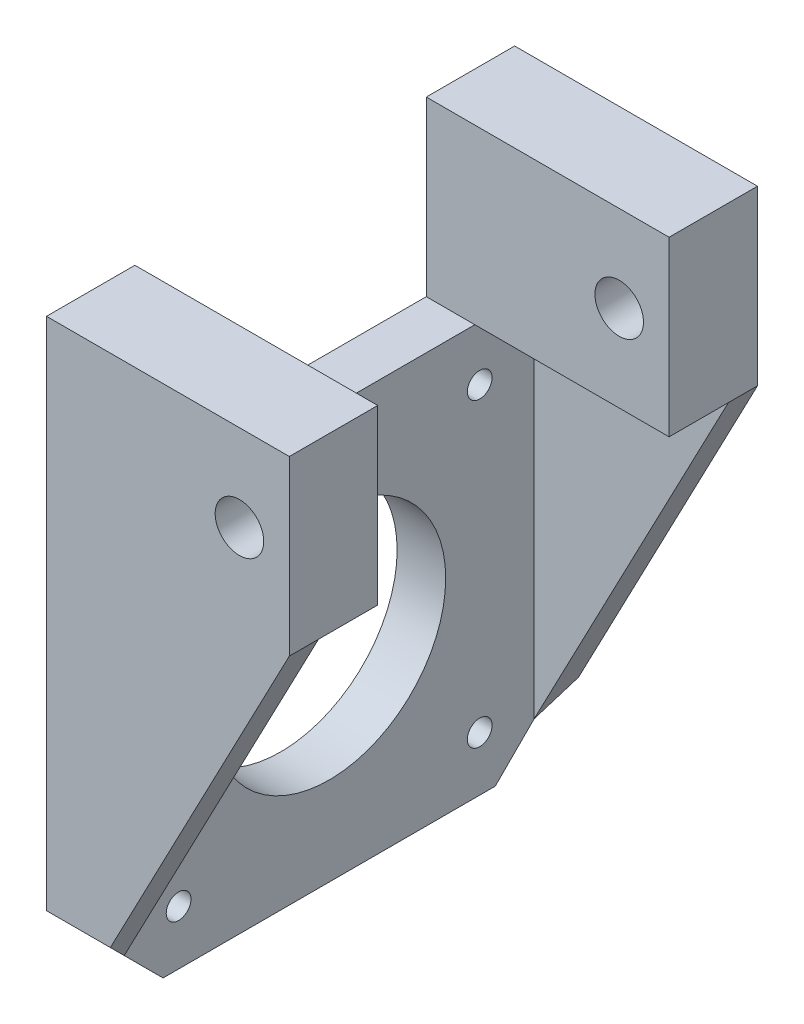
ISO-10303-21;
HEADER;
FILE_DESCRIPTION(('STEP AP214'),'2;1');
FILE_NAME('part.step','',(''),(''),'','','');
FILE_SCHEMA(('AUTOMOTIVE_DESIGN { 1 0 10303 214 1 1 1 1 }'));
ENDSEC;
DATA;
#1=APPLICATION_CONTEXT('core data for automotive mechanical design processes');
#2=APPLICATION_PROTOCOL_DEFINITION('international standard','automotive_design',2000,#1);
#3=PRODUCT_CONTEXT('',#1,'mechanical');
#4=PRODUCT('Part','Part','',(#3));
#5=PRODUCT_RELATED_PRODUCT_CATEGORY('part','',(#4));
#6=PRODUCT_DEFINITION_FORMATION('','',#4);
#7=PRODUCT_DEFINITION_CONTEXT('part definition',#1,'design');
#8=PRODUCT_DEFINITION('design','',#6,#7);
#9=PRODUCT_DEFINITION_SHAPE('','',#8);
#10=(LENGTH_UNIT() NAMED_UNIT(*) SI_UNIT(.MILLI.,.METRE.));
#11=(NAMED_UNIT(*) PLANE_ANGLE_UNIT() SI_UNIT($,.RADIAN.));
#12=(NAMED_UNIT(*) SI_UNIT($,.STERADIAN.) SOLID_ANGLE_UNIT());
#13=UNCERTAINTY_MEASURE_WITH_UNIT(LENGTH_MEASURE(1.E-05),#10,'distance_accuracy_value','');
#14=(GEOMETRIC_REPRESENTATION_CONTEXT(3) GLOBAL_UNCERTAINTY_ASSIGNED_CONTEXT((#13)) GLOBAL_UNIT_ASSIGNED_CONTEXT((#10,
#11,#12)) REPRESENTATION_CONTEXT('',''));
#15=CARTESIAN_POINT('',(0.,0.,0.));
#16=DIRECTION('',(0.,0.,1.));
#17=DIRECTION('',(1.,0.,0.));
#18=AXIS2_PLACEMENT_3D('',#15,#16,#17);
#19=CARTESIAN_POINT('',(5.,-14.8984585562319,-14.8984585562319));
#20=DIRECTION('',(0.,0.707106781186548,0.707106781186548));
#21=DIRECTION('',(0.,-0.707106781186548,0.707106781186548));
#22=AXIS2_PLACEMENT_3D('',#19,#20,#21);
#23=PLANE('',#22);
#24=DIRECTION('',(0.,0.707106781186548,-0.707106781186548));
#25=VECTOR('',#24,1.);
#26=CARTESIAN_POINT('',(0.,-14.8984585562319,-14.8984585562319));
#27=LINE('',#26,#25);
#28=CARTESIAN_POINT('',(0.,-34.1785648404354,4.38164772797147));
#29=VERTEX_POINT('',#28);
#30=CARTESIAN_POINT('',(0.,-27.1795648404353,-2.61735227202852));
#31=VERTEX_POINT('',#30);
#32=EDGE_CURVE('E159',#29,#31,#27,.T.);
#33=ORIENTED_EDGE('',*,*,#32,.T.);
#34=DIRECTION('',(1.,0.,0.));
#35=VECTOR('',#34,1.);
#36=CARTESIAN_POINT('',(-10.,-27.1795648404353,-2.61735227202852));
#37=LINE('',#36,#35);
#38=CARTESIAN_POINT('',(6.57063951205467,-27.1795648404353,-2.61735227202852));
#39=VERTEX_POINT('',#38);
#40=EDGE_CURVE('E185',#31,#39,#37,.T.);
#41=ORIENTED_EDGE('',*,*,#40,.T.);
#42=DIRECTION('',(0.347176559415175,0.663124587310955,-0.66312458731095));
#43=VECTOR('',#42,1.);
#44=CARTESIAN_POINT('',(5.69066393805867,-28.8603621855464,-0.936554926917474));
#45=LINE('',#44,#43);
#46=CARTESIAN_POINT('',(5.,-30.1795648404354,0.382647727971478));
#47=VERTEX_POINT('',#46);
#48=EDGE_CURVE('E192',#47,#39,#45,.T.);
#49=ORIENTED_EDGE('',*,*,#48,.F.);
#50=DIRECTION('',(0.,0.707106781186548,-0.707106781186548));
#51=VECTOR('',#50,1.);
#52=CARTESIAN_POINT('',(5.,-14.8984585562319,-14.8984585562319));
#53=LINE('',#52,#51);
#54=CARTESIAN_POINT('',(5.,-34.1785648404354,4.38164772797147));
#55=VERTEX_POINT('',#54);
#56=EDGE_CURVE('E135',#55,#47,#53,.T.);
#57=ORIENTED_EDGE('',*,*,#56,.F.);
#58=DIRECTION('',(-1.,0.,0.));
#59=VECTOR('',#58,1.);
#60=CARTESIAN_POINT('',(5.,-34.1785648404354,4.38164772797147));
#61=LINE('',#60,#59);
#62=EDGE_CURVE('E106',#55,#29,#61,.T.);
#63=ORIENTED_EDGE('',*,*,#62,.T.);
#64=EDGE_LOOP('',(#33,#41,#49,#57,#63));
#65=FACE_BOUND('',#64,.T.);
#66=ADVANCED_FACE('F45',(#65),#23,.F.);
#67=CARTESIAN_POINT('',(5.,8.02143515956464,0.));
#68=DIRECTION('',(0.,-1.,0.));
#69=DIRECTION('',(0.,0.,-1.));
#70=AXIS2_PLACEMENT_3D('',#67,#68,#69);
#71=PLANE('',#70);
#72=DIRECTION('',(1.,0.,0.));
#73=VECTOR('',#72,1.);
#74=CARTESIAN_POINT('',(25.,8.02143515956464,0.382647727971478));
#75=LINE('',#74,#73);
#76=CARTESIAN_POINT('',(5.,8.02143515956464,0.382647727971478));
#77=VERTEX_POINT('',#76);
#78=CARTESIAN_POINT('',(25.,8.02143515956464,0.382647727971478));
#79=VERTEX_POINT('',#78);
#80=EDGE_CURVE('E206',#77,#79,#75,.T.);
#81=ORIENTED_EDGE('',*,*,#80,.T.);
#82=DIRECTION('',(0.,0.,-1.));
#83=VECTOR('',#82,1.);
#84=CARTESIAN_POINT('',(25.,8.02143515956464,6.48264772797147));
#85=LINE('',#84,#83);
#86=CARTESIAN_POINT('',(25.,8.02143515956464,6.48264772797147));
#87=VERTEX_POINT('',#86);
#88=EDGE_CURVE('E221',#87,#79,#85,.T.);
#89=ORIENTED_EDGE('',*,*,#88,.F.);
#90=DIRECTION('',(-1.,0.,0.));
#91=VECTOR('',#90,1.);
#92=CARTESIAN_POINT('',(25.,8.02143515956464,6.48264772797147));
#93=LINE('',#92,#91);
#94=CARTESIAN_POINT('',(5.,8.02143515956464,6.48264772797147));
#95=VERTEX_POINT('',#94);
#96=EDGE_CURVE('E148',#87,#95,#93,.T.);
#97=ORIENTED_EDGE('',*,*,#96,.T.);
#98=DIRECTION('',(0.,0.,-1.));
#99=VECTOR('',#98,1.);
#100=CARTESIAN_POINT('',(5.,8.02143515956464,6.48264772797147));
#101=LINE('',#100,#99);
#102=EDGE_CURVE('E216',#95,#77,#101,.T.);
#103=ORIENTED_EDGE('',*,*,#102,.T.);
#104=EDGE_LOOP('',(#81,#89,#97,#103));
#105=FACE_BOUND('',#104,.T.);
#106=ADVANCED_FACE('F236',(#105),#71,.T.);
#107=CARTESIAN_POINT('',(5.,0.,-2.61735227202852));
#108=DIRECTION('',(0.,0.,1.));
#109=DIRECTION('',(0.,-1.,0.));
#110=AXIS2_PLACEMENT_3D('',#107,#108,#109);
#111=PLANE('',#110);
#112=CARTESIAN_POINT('',(19.8627287098755,16.9214351595647,-2.61735227202852));
#113=DIRECTION('',(0.,0.,1.));
#114=DIRECTION('',(0.,-1.,0.));
#115=AXIS2_PLACEMENT_3D('',#112,#113,#114);
#116=CIRCLE('',#115,2.5);
#117=CARTESIAN_POINT('',(19.8627287098755,14.4214351595647,-2.61735227202852));
#118=VERTEX_POINT('',#117);
#119=EDGE_CURVE('E193',#118,#118,#116,.T.);
#120=ORIENTED_EDGE('',*,*,#119,.T.);
#121=EDGE_LOOP('',(#120));
#122=FACE_BOUND('',#121,.T.);
#123=DIRECTION('',(-0.46382413738778,-0.88592729361753,0.));
#124=VECTOR('',#123,1.);
#125=CARTESIAN_POINT('',(5.,-30.1795648404354,-2.61735227202852));
#126=LINE('',#125,#124);
#127=CARTESIAN_POINT('',(25.,8.02143515956464,-2.61735227202852));
#128=VERTEX_POINT('',#127);
#129=EDGE_CURVE('E187',#128,#39,#126,.T.);
#130=ORIENTED_EDGE('',*,*,#129,.T.);
#131=ORIENTED_EDGE('',*,*,#40,.F.);
#132=DIRECTION('',(0.,1.,0.));
#133=VECTOR('',#132,1.);
#134=CARTESIAN_POINT('',(0.,0.,-2.61735227202852));
#135=LINE('',#134,#133);
#136=CARTESIAN_POINT('',(0.,25.8214351595647,-2.61735227202852));
#137=VERTEX_POINT('',#136);
#138=EDGE_CURVE('E163',#31,#137,#135,.T.);
#139=ORIENTED_EDGE('',*,*,#138,.T.);
#140=DIRECTION('',(-1.,0.,0.));
#141=VECTOR('',#140,1.);
#142=CARTESIAN_POINT('',(5.,25.8214351595647,-2.61735227202852));
#143=LINE('',#142,#141);
#144=CARTESIAN_POINT('',(25.,25.8214351595647,-2.61735227202852));
#145=VERTEX_POINT('',#144);
#146=EDGE_CURVE('E11',#145,#137,#143,.T.);
#147=ORIENTED_EDGE('',*,*,#146,.F.);
#148=DIRECTION('',(0.,1.,0.));
#149=VECTOR('',#148,1.);
#150=CARTESIAN_POINT('',(25.,25.8214351595647,-2.61735227202852));
#151=LINE('',#150,#149);
#152=EDGE_CURVE('E225',#128,#145,#151,.T.);
#153=ORIENTED_EDGE('',*,*,#152,.F.);
#154=EDGE_LOOP('',(#130,#131,#139,#147,#153));
#155=FACE_BOUND('',#154,.T.);
#156=ADVANCED_FACE('F180',(#122,#155),#111,.F.);
#157=CARTESIAN_POINT('',(5.,25.8214351595647,0.));
#158=DIRECTION('',(0.,-1.,0.));
#159=DIRECTION('',(0.,0.,-1.));
#160=AXIS2_PLACEMENT_3D('',#157,#158,#159);
#161=PLANE('',#160);
#162=DIRECTION('',(0.,0.,1.));
#163=VECTOR('',#162,1.);
#164=CARTESIAN_POINT('',(0.,25.8214351595647,0.));
#165=LINE('',#164,#163);
#166=CARTESIAN_POINT('',(0.,25.8214351595647,6.48264772797147));
#167=VERTEX_POINT('',#166);
#168=EDGE_CURVE('E95',#137,#167,#165,.T.);
#169=ORIENTED_EDGE('',*,*,#168,.T.);
#170=DIRECTION('',(-1.,0.,0.));
#171=VECTOR('',#170,1.);
#172=CARTESIAN_POINT('',(5.,25.8214351595647,6.48264772797147));
#173=LINE('',#172,#171);
#174=CARTESIAN_POINT('',(25.,25.8214351595647,6.48264772797147));
#175=VERTEX_POINT('',#174);
#176=EDGE_CURVE('E56',#175,#167,#173,.T.);
#177=ORIENTED_EDGE('',*,*,#176,.F.);
#178=DIRECTION('',(0.,0.,1.));
#179=VECTOR('',#178,1.);
#180=CARTESIAN_POINT('',(25.,25.8214351595647,6.48264772797147));
#181=LINE('',#180,#179);
#182=EDGE_CURVE('E228',#145,#175,#181,.T.);
#183=ORIENTED_EDGE('',*,*,#182,.F.);
#184=ORIENTED_EDGE('',*,*,#146,.T.);
#185=EDGE_LOOP('',(#169,#177,#183,#184));
#186=FACE_BOUND('',#185,.T.);
#187=ADVANCED_FACE('F167',(#186),#161,.F.);
#188=CARTESIAN_POINT('',(5.,0.,6.48264772797147));
#189=DIRECTION('',(0.,0.,-1.));
#190=DIRECTION('',(-1.,0.,0.));
#191=AXIS2_PLACEMENT_3D('',#188,#189,#190);
#192=PLANE('',#191);
#193=CARTESIAN_POINT('',(19.8627287098755,16.9214351595647,6.48264772797147));
#194=DIRECTION('',(0.,0.,-1.));
#195=DIRECTION('',(-1.,0.,0.));
#196=AXIS2_PLACEMENT_3D('',#193,#194,#195);
#197=CIRCLE('',#196,2.5);
#198=CARTESIAN_POINT('',(17.3627287098755,16.9214351595647,6.48264772797147));
#199=VERTEX_POINT('',#198);
#200=EDGE_CURVE('E49',#199,#199,#197,.T.);
#201=ORIENTED_EDGE('',*,*,#200,.T.);
#202=EDGE_LOOP('',(#201));
#203=FACE_BOUND('',#202,.T.);
#204=DIRECTION('',(0.,-1.,0.));
#205=VECTOR('',#204,1.);
#206=CARTESIAN_POINT('',(0.,0.,6.48264772797147));
#207=LINE('',#206,#205);
#208=CARTESIAN_POINT('',(0.,8.02143515956464,6.48264772797147));
#209=VERTEX_POINT('',#208);
#210=EDGE_CURVE('E82',#167,#209,#207,.T.);
#211=ORIENTED_EDGE('',*,*,#210,.T.);
#212=DIRECTION('',(-1.,0.,0.));
#213=VECTOR('',#212,1.);
#214=CARTESIAN_POINT('',(5.,8.02143515956464,6.48264772797147));
#215=LINE('',#214,#213);
#216=EDGE_CURVE('E86',#95,#209,#215,.T.);
#217=ORIENTED_EDGE('',*,*,#216,.F.);
#218=ORIENTED_EDGE('',*,*,#96,.F.);
#219=DIRECTION('',(0.,-1.,0.));
#220=VECTOR('',#219,1.);
#221=CARTESIAN_POINT('',(25.,25.8214351595647,6.48264772797147));
#222=LINE('',#221,#220);
#223=EDGE_CURVE('E217',#175,#87,#222,.T.);
#224=ORIENTED_EDGE('',*,*,#223,.F.);
#225=ORIENTED_EDGE('',*,*,#176,.T.);
#226=EDGE_LOOP('',(#211,#217,#218,#224,#225));
#227=FACE_BOUND('',#226,.T.);
#228=ADVANCED_FACE('F84',(#203,#227),#192,.F.);
#229=CARTESIAN_POINT('',(5.,8.02143515956464,0.));
#230=DIRECTION('',(0.,-1.,0.));
#231=DIRECTION('',(0.,0.,-1.));
#232=AXIS2_PLACEMENT_3D('',#229,#230,#231);
#233=PLANE('',#232);
#234=DIRECTION('',(0.,0.,1.));
#235=VECTOR('',#234,1.);
#236=CARTESIAN_POINT('',(0.,8.02143515956464,0.));
#237=LINE('',#236,#235);
#238=CARTESIAN_POINT('',(0.,8.02143515956464,36.4826477279715));
#239=VERTEX_POINT('',#238);
#240=EDGE_CURVE('E94',#209,#239,#237,.T.);
#241=ORIENTED_EDGE('',*,*,#240,.T.);
#242=DIRECTION('',(-1.,0.,0.));
#243=VECTOR('',#242,1.);
#244=CARTESIAN_POINT('',(5.,8.02143515956464,36.4826477279715));
#245=LINE('',#244,#243);
#246=CARTESIAN_POINT('',(5.,8.02143515956464,36.4826477279715));
#247=VERTEX_POINT('',#246);
#248=EDGE_CURVE('E346',#247,#239,#245,.T.);
#249=ORIENTED_EDGE('',*,*,#248,.F.);
#250=DIRECTION('',(0.,0.,1.));
#251=VECTOR('',#250,1.);
#252=CARTESIAN_POINT('',(5.,8.02143515956464,0.));
#253=LINE('',#252,#251);
#254=EDGE_CURVE('E104',#95,#247,#253,.T.);
#255=ORIENTED_EDGE('',*,*,#254,.F.);
#256=ORIENTED_EDGE('',*,*,#216,.T.);
#257=EDGE_LOOP('',(#241,#249,#255,#256));
#258=FACE_BOUND('',#257,.T.);
#259=ADVANCED_FACE('F99',(#258),#233,.F.);
#260=CARTESIAN_POINT('',(5.,-28.5785648404354,5.98264772797147));
#261=DIRECTION('',(-1.,0.,0.));
#262=DIRECTION('',(0.,0.,1.));
#263=AXIS2_PLACEMENT_3D('',#260,#261,#262);
#264=CYLINDRICAL_SURFACE('',#263,1.275);
#265=CARTESIAN_POINT('',(5.,-28.5785648404354,5.98264772797147));
#266=DIRECTION('',(1.,0.,0.));
#267=DIRECTION('',(0.,0.,-1.));
#268=AXIS2_PLACEMENT_3D('',#265,#266,#267);
#269=CIRCLE('',#268,1.275);
#270=CARTESIAN_POINT('',(5.,-28.5785648404354,4.70764772797147));
#271=VERTEX_POINT('',#270);
#272=EDGE_CURVE('E138',#271,#271,#269,.T.);
#273=ORIENTED_EDGE('',*,*,#272,.T.);
#274=EDGE_LOOP('',(#273));
#275=FACE_BOUND('',#274,.T.);
#276=CARTESIAN_POINT('',(0.,-28.5785648404354,5.98264772797147));
#277=DIRECTION('',(1.,0.,0.));
#278=DIRECTION('',(0.,0.,-1.));
#279=AXIS2_PLACEMENT_3D('',#276,#277,#278);
#280=CIRCLE('',#279,1.275);
#281=CARTESIAN_POINT('',(0.,-28.5785648404354,4.70764772797147));
#282=VERTEX_POINT('',#281);
#283=EDGE_CURVE('E155',#282,#282,#280,.T.);
#284=ORIENTED_EDGE('',*,*,#283,.F.);
#285=EDGE_LOOP('',(#284));
#286=FACE_BOUND('',#285,.T.);
#287=ADVANCED_FACE('F457',(#275,#286),#264,.F.);
#288=CARTESIAN_POINT('',(5.,2.42143515956463,5.98264772797147));
#289=DIRECTION('',(-1.,0.,0.));
#290=DIRECTION('',(0.,0.,1.));
#291=AXIS2_PLACEMENT_3D('',#288,#289,#290);
#292=CYLINDRICAL_SURFACE('',#291,1.275);
#293=CARTESIAN_POINT('',(5.,2.42143515956463,5.98264772797147));
#294=DIRECTION('',(1.,0.,0.));
#295=DIRECTION('',(0.,0.,-1.));
#296=AXIS2_PLACEMENT_3D('',#293,#294,#295);
#297=CIRCLE('',#296,1.275);
#298=CARTESIAN_POINT('',(5.,2.42143515956463,4.70764772797147));
#299=VERTEX_POINT('',#298);
#300=EDGE_CURVE('E119',#299,#299,#297,.T.);
#301=ORIENTED_EDGE('',*,*,#300,.T.);
#302=EDGE_LOOP('',(#301));
#303=FACE_BOUND('',#302,.T.);
#304=CARTESIAN_POINT('',(0.,2.42143515956463,5.98264772797147));
#305=DIRECTION('',(1.,0.,0.));
#306=DIRECTION('',(0.,0.,-1.));
#307=AXIS2_PLACEMENT_3D('',#304,#305,#306);
#308=CIRCLE('',#307,1.275);
#309=CARTESIAN_POINT('',(0.,2.42143515956463,4.70764772797147));
#310=VERTEX_POINT('',#309);
#311=EDGE_CURVE('E151',#310,#310,#308,.T.);
#312=ORIENTED_EDGE('',*,*,#311,.F.);
#313=EDGE_LOOP('',(#312));
#314=FACE_BOUND('',#313,.T.);
#315=ADVANCED_FACE('F47',(#303,#314),#292,.F.);
#316=CARTESIAN_POINT('',(5.,-34.1785648404354,0.));
#317=DIRECTION('',(0.,1.,0.));
#318=DIRECTION('',(0.,0.,1.));
#319=AXIS2_PLACEMENT_3D('',#316,#317,#318);
#320=PLANE('',#319);
#321=DIRECTION('',(0.,0.,-1.));
#322=VECTOR('',#321,1.);
#323=CARTESIAN_POINT('',(0.,-34.1785648404354,0.));
#324=LINE('',#323,#322);
#325=CARTESIAN_POINT('',(0.,-34.1785648404354,38.5836477279715));
#326=VERTEX_POINT('',#325);
#327=EDGE_CURVE('E116',#326,#29,#324,.T.);
#328=ORIENTED_EDGE('',*,*,#327,.T.);
#329=ORIENTED_EDGE('',*,*,#62,.F.);
#330=DIRECTION('',(0.,0.,-1.));
#331=VECTOR('',#330,1.);
#332=CARTESIAN_POINT('',(5.,-34.1785648404354,0.));
#333=LINE('',#332,#331);
#334=CARTESIAN_POINT('',(5.,-34.1785648404354,38.5836477279715));
#335=VERTEX_POINT('',#334);
#336=EDGE_CURVE('E63',#335,#55,#333,.T.);
#337=ORIENTED_EDGE('',*,*,#336,.F.);
#338=DIRECTION('',(-1.,0.,0.));
#339=VECTOR('',#338,1.);
#340=CARTESIAN_POINT('',(5.,-34.1785648404354,38.5836477279715));
#341=LINE('',#340,#339);
#342=EDGE_CURVE('E343',#335,#326,#341,.T.);
#343=ORIENTED_EDGE('',*,*,#342,.T.);
#344=EDGE_LOOP('',(#328,#329,#337,#343));
#345=FACE_BOUND('',#344,.T.);
#346=ADVANCED_FACE('F464',(#345),#320,.F.);
#347=CARTESIAN_POINT('',(5.,0.,0.));
#348=DIRECTION('',(1.,0.,0.));
#349=DIRECTION('',(0.,0.,-1.));
#350=AXIS2_PLACEMENT_3D('',#347,#348,#349);
#351=PLANE('',#350);
#352=CARTESIAN_POINT('',(5.,-13.0785648404354,21.4826477279715));
#353=DIRECTION('',(1.,0.,0.));
#354=DIRECTION('',(0.,0.,-1.));
#355=AXIS2_PLACEMENT_3D('',#352,#353,#354);
#356=CIRCLE('',#355,12.);
#357=CARTESIAN_POINT('',(5.,-13.0785648404354,9.48264772797147));
#358=VERTEX_POINT('',#357);
#359=EDGE_CURVE('E366',#358,#358,#356,.T.);
#360=ORIENTED_EDGE('',*,*,#359,.F.);
#361=EDGE_LOOP('',(#360));
#362=FACE_BOUND('',#361,.T.);
#363=ORIENTED_EDGE('',*,*,#102,.F.);
#364=ORIENTED_EDGE('',*,*,#254,.T.);
#365=DIRECTION('',(0.,0.,1.));
#366=VECTOR('',#365,1.);
#367=CARTESIAN_POINT('',(5.,8.02143515956464,36.4826477279715));
#368=LINE('',#367,#366);
#369=CARTESIAN_POINT('',(5.,8.02143515956464,42.5826477279715));
#370=VERTEX_POINT('',#369);
#371=EDGE_CURVE('E390',#247,#370,#368,.T.);
#372=ORIENTED_EDGE('',*,*,#371,.T.);
#373=DIRECTION('',(0.,1.,0.));
#374=VECTOR('',#373,1.);
#375=CARTESIAN_POINT('',(5.,0.,42.5826477279715));
#376=LINE('',#375,#374);
#377=CARTESIAN_POINT('',(5.,-30.1795648404354,42.5826477279715));
#378=VERTEX_POINT('',#377);
#379=EDGE_CURVE('E347',#378,#370,#376,.T.);
#380=ORIENTED_EDGE('',*,*,#379,.F.);
#381=DIRECTION('',(0.,0.707106781186548,0.707106781186548));
#382=VECTOR('',#381,1.);
#383=CARTESIAN_POINT('',(5.,-14.8984585562319,57.8637540121749));
#384=LINE('',#383,#382);
#385=EDGE_CURVE('E419',#335,#378,#384,.T.);
#386=ORIENTED_EDGE('',*,*,#385,.F.);
#387=ORIENTED_EDGE('',*,*,#336,.T.);
#388=ORIENTED_EDGE('',*,*,#56,.T.);
#389=DIRECTION('',(0.,1.,0.));
#390=VECTOR('',#389,1.);
#391=CARTESIAN_POINT('',(5.,0.,0.382647727971478));
#392=LINE('',#391,#390);
#393=EDGE_CURVE('E131',#47,#77,#392,.T.);
#394=ORIENTED_EDGE('',*,*,#393,.T.);
#395=EDGE_LOOP('',(#363,#364,#372,#380,#386,#387,#388,#394));
#396=FACE_BOUND('',#395,.T.);
#397=ORIENTED_EDGE('',*,*,#300,.F.);
#398=EDGE_LOOP('',(#397));
#399=FACE_BOUND('',#398,.T.);
#400=ORIENTED_EDGE('',*,*,#272,.F.);
#401=EDGE_LOOP('',(#400));
#402=FACE_BOUND('',#401,.T.);
#403=CARTESIAN_POINT('',(5.,2.42143515956463,36.9826477279715));
#404=DIRECTION('',(-1.,0.,0.));
#405=DIRECTION('',(0.,0.,1.));
#406=AXIS2_PLACEMENT_3D('',#403,#404,#405);
#407=CIRCLE('',#406,1.275);
#408=CARTESIAN_POINT('',(5.,2.42143515956463,38.2576477279715));
#409=VERTEX_POINT('',#408);
#410=EDGE_CURVE('E342',#409,#409,#407,.T.);
#411=ORIENTED_EDGE('',*,*,#410,.T.);
#412=EDGE_LOOP('',(#411));
#413=FACE_BOUND('',#412,.T.);
#414=CARTESIAN_POINT('',(5.,-28.5785648404354,36.9826477279715));
#415=DIRECTION('',(-1.,0.,0.));
#416=DIRECTION('',(0.,0.,1.));
#417=AXIS2_PLACEMENT_3D('',#414,#415,#416);
#418=CIRCLE('',#417,1.275);
#419=CARTESIAN_POINT('',(5.,-28.5785648404354,38.2576477279715));
#420=VERTEX_POINT('',#419);
#421=EDGE_CURVE('E415',#420,#420,#418,.T.);
#422=ORIENTED_EDGE('',*,*,#421,.T.);
#423=EDGE_LOOP('',(#422));
#424=FACE_BOUND('',#423,.T.);
#425=ADVANCED_FACE('F242',(#362,#396,#399,#402,#413,#424),#351,.T.);
#426=CARTESIAN_POINT('',(0.,0.,0.));
#427=DIRECTION('',(1.,0.,0.));
#428=DIRECTION('',(0.,0.,-1.));
#429=AXIS2_PLACEMENT_3D('',#426,#427,#428);
#430=PLANE('',#429);
#431=CARTESIAN_POINT('',(0.,-13.0785648404354,21.4826477279715));
#432=DIRECTION('',(1.,0.,0.));
#433=DIRECTION('',(0.,0.,-1.));
#434=AXIS2_PLACEMENT_3D('',#431,#432,#433);
#435=CIRCLE('',#434,12.);
#436=CARTESIAN_POINT('',(0.,-13.0785648404354,9.48264772797147));
#437=VERTEX_POINT('',#436);
#438=EDGE_CURVE('E358',#437,#437,#435,.T.);
#439=ORIENTED_EDGE('',*,*,#438,.T.);
#440=EDGE_LOOP('',(#439));
#441=FACE_BOUND('',#440,.T.);
#442=ORIENTED_EDGE('',*,*,#311,.T.);
#443=EDGE_LOOP('',(#442));
#444=FACE_BOUND('',#443,.T.);
#445=ORIENTED_EDGE('',*,*,#283,.T.);
#446=EDGE_LOOP('',(#445));
#447=FACE_BOUND('',#446,.T.);
#448=ORIENTED_EDGE('',*,*,#138,.F.);
#449=ORIENTED_EDGE('',*,*,#32,.F.);
#450=ORIENTED_EDGE('',*,*,#327,.F.);
#451=DIRECTION('',(0.,0.707106781186548,0.707106781186548));
#452=VECTOR('',#451,1.);
#453=CARTESIAN_POINT('',(0.,-14.8984585562319,57.8637540121749));
#454=LINE('',#453,#452);
#455=CARTESIAN_POINT('',(0.,-27.1795648404353,45.5826477279715));
#456=VERTEX_POINT('',#455);
#457=EDGE_CURVE('E316',#326,#456,#454,.T.);
#458=ORIENTED_EDGE('',*,*,#457,.T.);
#459=DIRECTION('',(0.,1.,0.));
#460=VECTOR('',#459,1.);
#461=CARTESIAN_POINT('',(0.,0.,45.5826477279715));
#462=LINE('',#461,#460);
#463=CARTESIAN_POINT('',(0.,25.8214351595647,45.5826477279715));
#464=VERTEX_POINT('',#463);
#465=EDGE_CURVE('E304',#456,#464,#462,.T.);
#466=ORIENTED_EDGE('',*,*,#465,.T.);
#467=DIRECTION('',(0.,0.,-1.));
#468=VECTOR('',#467,1.);
#469=CARTESIAN_POINT('',(0.,25.8214351595647,42.9652954559429));
#470=LINE('',#469,#468);
#471=CARTESIAN_POINT('',(0.,25.8214351595647,36.4826477279715));
#472=VERTEX_POINT('',#471);
#473=EDGE_CURVE('E315',#464,#472,#470,.T.);
#474=ORIENTED_EDGE('',*,*,#473,.T.);
#475=DIRECTION('',(0.,-1.,0.));
#476=VECTOR('',#475,1.);
#477=CARTESIAN_POINT('',(0.,0.,36.4826477279715));
#478=LINE('',#477,#476);
#479=EDGE_CURVE('E114',#472,#239,#478,.T.);
#480=ORIENTED_EDGE('',*,*,#479,.T.);
#481=ORIENTED_EDGE('',*,*,#240,.F.);
#482=ORIENTED_EDGE('',*,*,#210,.F.);
#483=ORIENTED_EDGE('',*,*,#168,.F.);
#484=EDGE_LOOP('',(#448,#449,#450,#458,#466,#474,#480,#481,#482,#483));
#485=FACE_BOUND('',#484,.T.);
#486=CARTESIAN_POINT('',(0.,2.42143515956463,36.9826477279715));
#487=DIRECTION('',(-1.,0.,0.));
#488=DIRECTION('',(0.,0.,1.));
#489=AXIS2_PLACEMENT_3D('',#486,#487,#488);
#490=CIRCLE('',#489,1.275);
#491=CARTESIAN_POINT('',(0.,2.42143515956463,38.2576477279715));
#492=VERTEX_POINT('',#491);
#493=EDGE_CURVE('E334',#492,#492,#490,.T.);
#494=ORIENTED_EDGE('',*,*,#493,.F.);
#495=EDGE_LOOP('',(#494));
#496=FACE_BOUND('',#495,.T.);
#497=CARTESIAN_POINT('',(0.,-28.5785648404354,36.9826477279715));
#498=DIRECTION('',(-1.,0.,0.));
#499=DIRECTION('',(0.,0.,1.));
#500=AXIS2_PLACEMENT_3D('',#497,#498,#499);
#501=CIRCLE('',#500,1.275);
#502=CARTESIAN_POINT('',(0.,-28.5785648404354,38.2576477279715));
#503=VERTEX_POINT('',#502);
#504=EDGE_CURVE('E330',#503,#503,#501,.T.);
#505=ORIENTED_EDGE('',*,*,#504,.F.);
#506=EDGE_LOOP('',(#505));
#507=FACE_BOUND('',#506,.T.);
#508=ADVANCED_FACE('F110',(#441,#444,#447,#485,#496,#507),#430,.F.);
#509=CARTESIAN_POINT('',(25.,0.,0.));
#510=DIRECTION('',(1.,0.,0.));
#511=DIRECTION('',(0.,0.,-1.));
#512=AXIS2_PLACEMENT_3D('',#509,#510,#511);
#513=PLANE('',#512);
#514=ORIENTED_EDGE('',*,*,#223,.T.);
#515=ORIENTED_EDGE('',*,*,#88,.T.);
#516=DIRECTION('',(0.,0.,1.));
#517=VECTOR('',#516,1.);
#518=CARTESIAN_POINT('',(25.,8.02143515956464,-2.61735227202852));
#519=LINE('',#518,#517);
#520=EDGE_CURVE('E205',#128,#79,#519,.T.);
#521=ORIENTED_EDGE('',*,*,#520,.F.);
#522=ORIENTED_EDGE('',*,*,#152,.T.);
#523=ORIENTED_EDGE('',*,*,#182,.T.);
#524=EDGE_LOOP('',(#514,#515,#521,#522,#523));
#525=FACE_BOUND('',#524,.T.);
#526=ADVANCED_FACE('F256',(#525),#513,.T.);
#527=CARTESIAN_POINT('',(5.,-30.1795648404354,-2.61735227202852));
#528=DIRECTION('',(-0.88592729361753,0.46382413738778,0.));
#529=DIRECTION('',(-0.463824137387781,-0.88592729361753,0.));
#530=AXIS2_PLACEMENT_3D('',#527,#528,#529);
#531=PLANE('',#530);
#532=DIRECTION('',(-0.46382413738778,-0.88592729361753,0.));
#533=VECTOR('',#532,1.);
#534=CARTESIAN_POINT('',(5.,-30.1795648404354,0.382647727971478));
#535=LINE('',#534,#533);
#536=EDGE_CURVE('E197',#79,#47,#535,.T.);
#537=ORIENTED_EDGE('',*,*,#536,.T.);
#538=ORIENTED_EDGE('',*,*,#48,.T.);
#539=ORIENTED_EDGE('',*,*,#129,.F.);
#540=ORIENTED_EDGE('',*,*,#520,.T.);
#541=EDGE_LOOP('',(#537,#538,#539,#540));
#542=FACE_BOUND('',#541,.T.);
#543=ADVANCED_FACE('F251',(#542),#531,.F.);
#544=CARTESIAN_POINT('',(0.,0.,0.382647727971478));
#545=DIRECTION('',(0.,0.,1.));
#546=DIRECTION('',(1.,0.,0.));
#547=AXIS2_PLACEMENT_3D('',#544,#545,#546);
#548=PLANE('',#547);
#549=ORIENTED_EDGE('',*,*,#80,.F.);
#550=ORIENTED_EDGE('',*,*,#393,.F.);
#551=ORIENTED_EDGE('',*,*,#536,.F.);
#552=EDGE_LOOP('',(#549,#550,#551));
#553=FACE_BOUND('',#552,.T.);
#554=ADVANCED_FACE('F248',(#553),#548,.T.);
#555=CARTESIAN_POINT('',(19.8627287098755,16.9214351595647,12.3826477279715));
#556=DIRECTION('',(0.,0.,-1.));
#557=DIRECTION('',(0.,1.,0.));
#558=AXIS2_PLACEMENT_3D('',#555,#556,#557);
#559=CYLINDRICAL_SURFACE('',#558,2.5);
#560=ORIENTED_EDGE('',*,*,#200,.F.);
#561=EDGE_LOOP('',(#560));
#562=FACE_BOUND('',#561,.T.);
#563=ORIENTED_EDGE('',*,*,#119,.F.);
#564=EDGE_LOOP('',(#563));
#565=FACE_BOUND('',#564,.T.);
#566=ADVANCED_FACE('F496',(#562,#565),#559,.F.);
#567=CARTESIAN_POINT('',(5.,-14.8984585562319,57.8637540121749));
#568=DIRECTION('',(0.,0.707106781186548,-0.707106781186548));
#569=DIRECTION('',(0.,-0.707106781186548,-0.707106781186548));
#570=AXIS2_PLACEMENT_3D('',#567,#568,#569);
#571=PLANE('',#570);
#572=ORIENTED_EDGE('',*,*,#457,.F.);
#573=ORIENTED_EDGE('',*,*,#342,.F.);
#574=ORIENTED_EDGE('',*,*,#385,.T.);
#575=DIRECTION('',(0.347176559415175,0.663124587310955,0.66312458731095));
#576=VECTOR('',#575,1.);
#577=CARTESIAN_POINT('',(5.69066393805867,-28.8603621855464,43.9018503828604));
#578=LINE('',#577,#576);
#579=CARTESIAN_POINT('',(6.57063951205467,-27.1795648404353,45.5826477279715));
#580=VERTEX_POINT('',#579);
#581=EDGE_CURVE('E324',#378,#580,#578,.T.);
#582=ORIENTED_EDGE('',*,*,#581,.T.);
#583=DIRECTION('',(1.,0.,0.));
#584=VECTOR('',#583,1.);
#585=CARTESIAN_POINT('',(-10.,-27.1795648404353,45.5826477279715));
#586=LINE('',#585,#584);
#587=EDGE_CURVE('E308',#456,#580,#586,.T.);
#588=ORIENTED_EDGE('',*,*,#587,.F.);
#589=EDGE_LOOP('',(#572,#573,#574,#582,#588));
#590=FACE_BOUND('',#589,.T.);
#591=ADVANCED_FACE('F320',(#590),#571,.F.);
#592=CARTESIAN_POINT('',(5.,8.02143515956464,42.9652954559429));
#593=DIRECTION('',(0.,-1.,0.));
#594=DIRECTION('',(0.,0.,1.));
#595=AXIS2_PLACEMENT_3D('',#592,#593,#594);
#596=PLANE('',#595);
#597=DIRECTION('',(1.,0.,0.));
#598=VECTOR('',#597,1.);
#599=CARTESIAN_POINT('',(25.,8.02143515956464,42.5826477279715));
#600=LINE('',#599,#598);
#601=CARTESIAN_POINT('',(25.,8.02143515956464,42.5826477279715));
#602=VERTEX_POINT('',#601);
#603=EDGE_CURVE('E381',#370,#602,#600,.T.);
#604=ORIENTED_EDGE('',*,*,#603,.F.);
#605=ORIENTED_EDGE('',*,*,#371,.F.);
#606=DIRECTION('',(-1.,0.,0.));
#607=VECTOR('',#606,1.);
#608=CARTESIAN_POINT('',(25.,8.02143515956464,36.4826477279715));
#609=LINE('',#608,#607);
#610=CARTESIAN_POINT('',(25.,8.02143515956464,36.4826477279715));
#611=VERTEX_POINT('',#610);
#612=EDGE_CURVE('E405',#611,#247,#609,.T.);
#613=ORIENTED_EDGE('',*,*,#612,.F.);
#614=DIRECTION('',(0.,0.,1.));
#615=VECTOR('',#614,1.);
#616=CARTESIAN_POINT('',(25.,8.02143515956464,36.4826477279715));
#617=LINE('',#616,#615);
#618=EDGE_CURVE('E394',#611,#602,#617,.T.);
#619=ORIENTED_EDGE('',*,*,#618,.T.);
#620=EDGE_LOOP('',(#604,#605,#613,#619));
#621=FACE_BOUND('',#620,.T.);
#622=ADVANCED_FACE('F504',(#621),#596,.T.);
#623=CARTESIAN_POINT('',(5.,0.,45.5826477279715));
#624=DIRECTION('',(0.,0.,-1.));
#625=DIRECTION('',(0.,-1.,0.));
#626=AXIS2_PLACEMENT_3D('',#623,#624,#625);
#627=PLANE('',#626);
#628=CARTESIAN_POINT('',(19.8627287098755,16.9214351595647,45.5826477279715));
#629=DIRECTION('',(0.,0.,1.));
#630=DIRECTION('',(0.,-1.,0.));
#631=AXIS2_PLACEMENT_3D('',#628,#629,#630);
#632=CIRCLE('',#631,2.5);
#633=CARTESIAN_POINT('',(19.8627287098755,14.4214351595647,45.5826477279715));
#634=VERTEX_POINT('',#633);
#635=EDGE_CURVE('E326',#634,#634,#632,.T.);
#636=ORIENTED_EDGE('',*,*,#635,.F.);
#637=EDGE_LOOP('',(#636));
#638=FACE_BOUND('',#637,.T.);
#639=DIRECTION('',(-0.46382413738778,-0.88592729361753,0.));
#640=VECTOR('',#639,1.);
#641=CARTESIAN_POINT('',(5.,-30.1795648404354,45.5826477279715));
#642=LINE('',#641,#640);
#643=CARTESIAN_POINT('',(25.,8.02143515956464,45.5826477279715));
#644=VERTEX_POINT('',#643);
#645=EDGE_CURVE('E377',#644,#580,#642,.T.);
#646=ORIENTED_EDGE('',*,*,#645,.F.);
#647=DIRECTION('',(0.,1.,0.));
#648=VECTOR('',#647,1.);
#649=CARTESIAN_POINT('',(25.,25.8214351595647,45.5826477279715));
#650=LINE('',#649,#648);
#651=CARTESIAN_POINT('',(25.,25.8214351595647,45.5826477279715));
#652=VERTEX_POINT('',#651);
#653=EDGE_CURVE('E398',#644,#652,#650,.T.);
#654=ORIENTED_EDGE('',*,*,#653,.T.);
#655=DIRECTION('',(-1.,0.,0.));
#656=VECTOR('',#655,1.);
#657=CARTESIAN_POINT('',(5.,25.8214351595647,45.5826477279715));
#658=LINE('',#657,#656);
#659=EDGE_CURVE('E312',#652,#464,#658,.T.);
#660=ORIENTED_EDGE('',*,*,#659,.T.);
#661=ORIENTED_EDGE('',*,*,#465,.F.);
#662=ORIENTED_EDGE('',*,*,#587,.T.);
#663=EDGE_LOOP('',(#646,#654,#660,#661,#662));
#664=FACE_BOUND('',#663,.T.);
#665=ADVANCED_FACE('F307',(#638,#664),#627,.F.);
#666=CARTESIAN_POINT('',(5.,25.8214351595647,42.9652954559429));
#667=DIRECTION('',(0.,-1.,0.));
#668=DIRECTION('',(0.,0.,1.));
#669=AXIS2_PLACEMENT_3D('',#666,#667,#668);
#670=PLANE('',#669);
#671=ORIENTED_EDGE('',*,*,#473,.F.);
#672=ORIENTED_EDGE('',*,*,#659,.F.);
#673=DIRECTION('',(0.,0.,-1.));
#674=VECTOR('',#673,1.);
#675=CARTESIAN_POINT('',(25.,25.8214351595647,36.4826477279715));
#676=LINE('',#675,#674);
#677=CARTESIAN_POINT('',(25.,25.8214351595647,36.4826477279715));
#678=VERTEX_POINT('',#677);
#679=EDGE_CURVE('E401',#652,#678,#676,.T.);
#680=ORIENTED_EDGE('',*,*,#679,.T.);
#681=DIRECTION('',(-1.,0.,0.));
#682=VECTOR('',#681,1.);
#683=CARTESIAN_POINT('',(5.,25.8214351595647,36.4826477279715));
#684=LINE('',#683,#682);
#685=EDGE_CURVE('E350',#678,#472,#684,.T.);
#686=ORIENTED_EDGE('',*,*,#685,.T.);
#687=EDGE_LOOP('',(#671,#672,#680,#686));
#688=FACE_BOUND('',#687,.T.);
#689=ADVANCED_FACE('F445',(#688),#670,.F.);
#690=CARTESIAN_POINT('',(5.,0.,36.4826477279715));
#691=DIRECTION('',(0.,0.,1.));
#692=DIRECTION('',(-1.,0.,0.));
#693=AXIS2_PLACEMENT_3D('',#690,#691,#692);
#694=PLANE('',#693);
#695=CARTESIAN_POINT('',(19.8627287098755,16.9214351595647,36.4826477279715));
#696=DIRECTION('',(0.,0.,-1.));
#697=DIRECTION('',(-1.,0.,0.));
#698=AXIS2_PLACEMENT_3D('',#695,#696,#697);
#699=CIRCLE('',#698,2.5);
#700=CARTESIAN_POINT('',(17.3627287098755,16.9214351595647,36.4826477279715));
#701=VERTEX_POINT('',#700);
#702=EDGE_CURVE('E355',#701,#701,#699,.T.);
#703=ORIENTED_EDGE('',*,*,#702,.F.);
#704=EDGE_LOOP('',(#703));
#705=FACE_BOUND('',#704,.T.);
#706=ORIENTED_EDGE('',*,*,#479,.F.);
#707=ORIENTED_EDGE('',*,*,#685,.F.);
#708=DIRECTION('',(0.,-1.,0.));
#709=VECTOR('',#708,1.);
#710=CARTESIAN_POINT('',(25.,25.8214351595647,36.4826477279715));
#711=LINE('',#710,#709);
#712=EDGE_CURVE('E391',#678,#611,#711,.T.);
#713=ORIENTED_EDGE('',*,*,#712,.T.);
#714=ORIENTED_EDGE('',*,*,#612,.T.);
#715=ORIENTED_EDGE('',*,*,#248,.T.);
#716=EDGE_LOOP('',(#706,#707,#713,#714,#715));
#717=FACE_BOUND('',#716,.T.);
#718=ADVANCED_FACE('F435',(#705,#717),#694,.F.);
#719=CARTESIAN_POINT('',(5.,-28.5785648404354,36.9826477279715));
#720=DIRECTION('',(-1.,0.,0.));
#721=DIRECTION('',(0.,0.,-1.));
#722=AXIS2_PLACEMENT_3D('',#719,#720,#721);
#723=CYLINDRICAL_SURFACE('',#722,1.275);
#724=ORIENTED_EDGE('',*,*,#421,.F.);
#725=EDGE_LOOP('',(#724));
#726=FACE_BOUND('',#725,.T.);
#727=ORIENTED_EDGE('',*,*,#504,.T.);
#728=EDGE_LOOP('',(#727));
#729=FACE_BOUND('',#728,.T.);
#730=ADVANCED_FACE('F433',(#726,#729),#723,.F.);
#731=CARTESIAN_POINT('',(5.,2.42143515956463,36.9826477279715));
#732=DIRECTION('',(-1.,0.,0.));
#733=DIRECTION('',(0.,0.,-1.));
#734=AXIS2_PLACEMENT_3D('',#731,#732,#733);
#735=CYLINDRICAL_SURFACE('',#734,1.275);
#736=ORIENTED_EDGE('',*,*,#410,.F.);
#737=EDGE_LOOP('',(#736));
#738=FACE_BOUND('',#737,.T.);
#739=ORIENTED_EDGE('',*,*,#493,.T.);
#740=EDGE_LOOP('',(#739));
#741=FACE_BOUND('',#740,.T.);
#742=ADVANCED_FACE('F427',(#738,#741),#735,.F.);
#743=CARTESIAN_POINT('',(25.,0.,42.9652954559429));
#744=DIRECTION('',(1.,0.,0.));
#745=DIRECTION('',(0.,0.,1.));
#746=AXIS2_PLACEMENT_3D('',#743,#744,#745);
#747=PLANE('',#746);
#748=ORIENTED_EDGE('',*,*,#712,.F.);
#749=ORIENTED_EDGE('',*,*,#679,.F.);
#750=ORIENTED_EDGE('',*,*,#653,.F.);
#751=DIRECTION('',(0.,0.,-1.));
#752=VECTOR('',#751,1.);
#753=CARTESIAN_POINT('',(25.,8.02143515956464,45.5826477279715));
#754=LINE('',#753,#752);
#755=EDGE_CURVE('E380',#644,#602,#754,.T.);
#756=ORIENTED_EDGE('',*,*,#755,.T.);
#757=ORIENTED_EDGE('',*,*,#618,.F.);
#758=EDGE_LOOP('',(#748,#749,#750,#756,#757));
#759=FACE_BOUND('',#758,.T.);
#760=ADVANCED_FACE('F442',(#759),#747,.T.);
#761=CARTESIAN_POINT('',(5.,-30.1795648404354,45.5826477279715));
#762=DIRECTION('',(-0.88592729361753,0.46382413738778,0.));
#763=DIRECTION('',(-0.463824137387781,-0.88592729361753,0.));
#764=AXIS2_PLACEMENT_3D('',#761,#762,#763);
#765=PLANE('',#764);
#766=DIRECTION('',(-0.46382413738778,-0.88592729361753,0.));
#767=VECTOR('',#766,1.);
#768=CARTESIAN_POINT('',(5.,-30.1795648404354,42.5826477279715));
#769=LINE('',#768,#767);
#770=EDGE_CURVE('E376',#602,#378,#769,.T.);
#771=ORIENTED_EDGE('',*,*,#770,.F.);
#772=ORIENTED_EDGE('',*,*,#755,.F.);
#773=ORIENTED_EDGE('',*,*,#645,.T.);
#774=ORIENTED_EDGE('',*,*,#581,.F.);
#775=EDGE_LOOP('',(#771,#772,#773,#774));
#776=FACE_BOUND('',#775,.T.);
#777=ADVANCED_FACE('F548',(#776),#765,.F.);
#778=CARTESIAN_POINT('',(0.,0.,42.5826477279715));
#779=DIRECTION('',(0.,0.,-1.));
#780=DIRECTION('',(1.,0.,0.));
#781=AXIS2_PLACEMENT_3D('',#778,#779,#780);
#782=PLANE('',#781);
#783=ORIENTED_EDGE('',*,*,#603,.T.);
#784=ORIENTED_EDGE('',*,*,#770,.T.);
#785=ORIENTED_EDGE('',*,*,#379,.T.);
#786=EDGE_LOOP('',(#783,#784,#785));
#787=FACE_BOUND('',#786,.T.);
#788=ADVANCED_FACE('F541',(#787),#782,.T.);
#789=CARTESIAN_POINT('',(19.8627287098755,16.9214351595647,30.5826477279715));
#790=DIRECTION('',(0.,0.,1.));
#791=DIRECTION('',(0.,1.,0.));
#792=AXIS2_PLACEMENT_3D('',#789,#790,#791);
#793=CYLINDRICAL_SURFACE('',#792,2.5);
#794=ORIENTED_EDGE('',*,*,#702,.T.);
#795=EDGE_LOOP('',(#794));
#796=FACE_BOUND('',#795,.T.);
#797=ORIENTED_EDGE('',*,*,#635,.T.);
#798=EDGE_LOOP('',(#797));
#799=FACE_BOUND('',#798,.T.);
#800=ADVANCED_FACE('F531',(#796,#799),#793,.F.);
#801=CARTESIAN_POINT('',(0.,-13.0785648404354,21.4826477279715));
#802=DIRECTION('',(1.,0.,0.));
#803=DIRECTION('',(0.,0.,-1.));
#804=AXIS2_PLACEMENT_3D('',#801,#802,#803);
#805=CYLINDRICAL_SURFACE('',#804,12.);
#806=ORIENTED_EDGE('',*,*,#438,.F.);
#807=EDGE_LOOP('',(#806));
#808=FACE_BOUND('',#807,.T.);
#809=ORIENTED_EDGE('',*,*,#359,.T.);
#810=EDGE_LOOP('',(#809));
#811=FACE_BOUND('',#810,.T.);
#812=ADVANCED_FACE('F528',(#808,#811),#805,.F.);
#813=CLOSED_SHELL('',(#66,#106,#156,#187,#228,#259,#287,#315,#346,#425,#508,#526,#543,#554,#566,
#591,#622,#665,#689,#718,#730,#742,#760,#777,#788,#800,#812));
#814=MANIFOLD_SOLID_BREP('B2',#813);
#815=ADVANCED_BREP_SHAPE_REPRESENTATION('',(#18,#814),#14);
#816=SHAPE_DEFINITION_REPRESENTATION(#9,#815);
ENDSEC;
END-ISO-10303-21;
